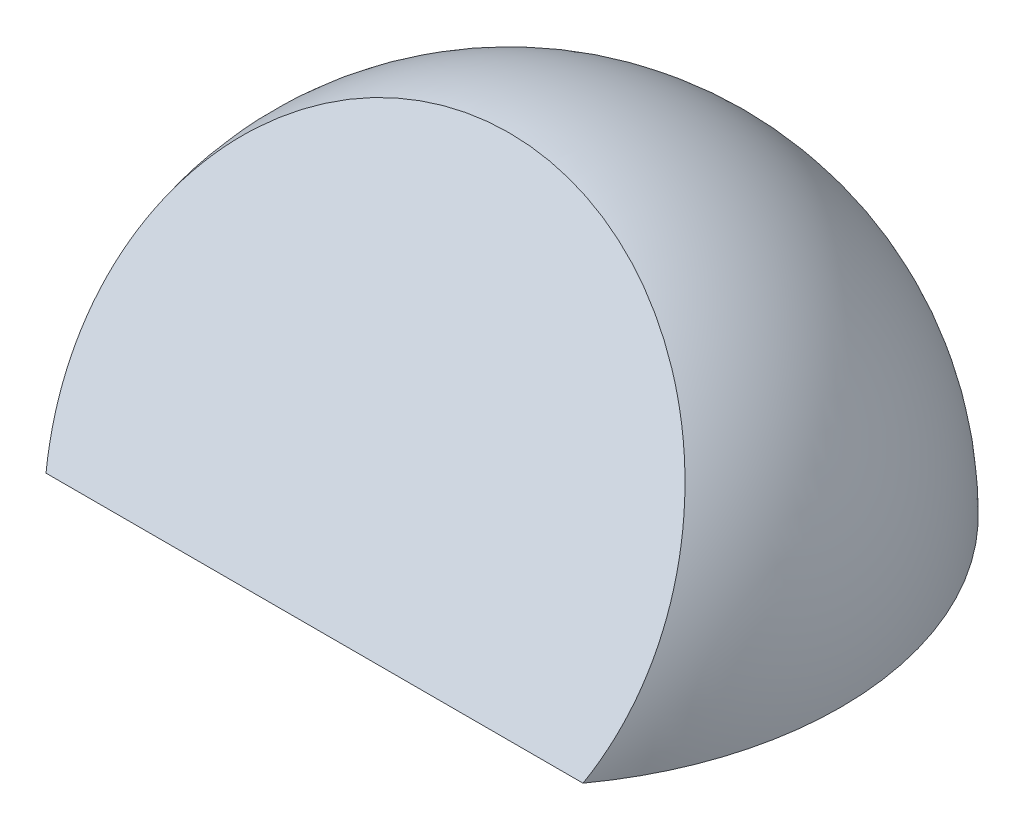
ISO-10303-21;
HEADER;
FILE_DESCRIPTION(('STEP AP214'),'2;1');
FILE_NAME('part.step','',(''),(''),'','','');
FILE_SCHEMA(('AUTOMOTIVE_DESIGN { 1 0 10303 214 1 1 1 1 }'));
ENDSEC;
DATA;
#1=APPLICATION_CONTEXT('core data for automotive mechanical design processes');
#2=APPLICATION_PROTOCOL_DEFINITION('international standard','automotive_design',2000,#1);
#3=PRODUCT_CONTEXT('',#1,'mechanical');
#4=PRODUCT('Part','Part','',(#3));
#5=PRODUCT_RELATED_PRODUCT_CATEGORY('part','',(#4));
#6=PRODUCT_DEFINITION_FORMATION('','',#4);
#7=PRODUCT_DEFINITION_CONTEXT('part definition',#1,'design');
#8=PRODUCT_DEFINITION('design','',#6,#7);
#9=PRODUCT_DEFINITION_SHAPE('','',#8);
#10=(LENGTH_UNIT() NAMED_UNIT(*) SI_UNIT(.MILLI.,.METRE.));
#11=(NAMED_UNIT(*) PLANE_ANGLE_UNIT() SI_UNIT($,.RADIAN.));
#12=(NAMED_UNIT(*) SI_UNIT($,.STERADIAN.) SOLID_ANGLE_UNIT());
#13=UNCERTAINTY_MEASURE_WITH_UNIT(LENGTH_MEASURE(1.E-05),#10,'distance_accuracy_value','');
#14=(GEOMETRIC_REPRESENTATION_CONTEXT(3) GLOBAL_UNCERTAINTY_ASSIGNED_CONTEXT((#13)) GLOBAL_UNIT_ASSIGNED_CONTEXT((#10,
#11,#12)) REPRESENTATION_CONTEXT('',''));
#15=CARTESIAN_POINT('',(0.,0.,0.));
#16=DIRECTION('',(0.,0.,1.));
#17=DIRECTION('',(1.,0.,0.));
#18=AXIS2_PLACEMENT_3D('',#15,#16,#17);
#19=CARTESIAN_POINT('',(-3.34897331317427,24.8888594866687,88.2251038844284));
#20=DIRECTION('',(0.,0.506284285163045,0.862366640470829));
#21=DIRECTION('',(0.,-0.862366640470829,0.506284285163045));
#22=AXIS2_PLACEMENT_3D('',#19,#20,#21);
#23=PLANE('',#22);
#24=DIRECTION('',(1.,0.,0.));
#25=VECTOR('',#24,1.);
#26=CARTESIAN_POINT('',(-3.34897331317427,6.41500741416223E-12,102.837030926097));
#27=LINE('',#26,#25);
#28=CARTESIAN_POINT('',(-86.7237021897946,6.41500741416223E-12,102.837030926097));
#29=VERTEX_POINT('',#28);
#30=CARTESIAN_POINT('',(80.0257555634461,6.41500741416223E-12,102.837030926097));
#31=VERTEX_POINT('',#30);
#32=EDGE_CURVE('E61',#29,#31,#27,.T.);
#33=ORIENTED_EDGE('',*,*,#32,.F.);
#34=CARTESIAN_POINT('',(-3.34897331317427,24.8888594866687,88.2251038844284));
#35=DIRECTION('',(0.,0.506284285163045,0.862366640470829));
#36=DIRECTION('',(0.,-0.862366640470829,0.506284285163045));
#37=AXIS2_PLACEMENT_3D('',#34,#35,#36);
#38=CIRCLE('',#37,88.2287320189306);
#39=EDGE_CURVE('E11',#31,#29,#38,.T.);
#40=ORIENTED_EDGE('',*,*,#39,.F.);
#41=EDGE_LOOP('',(#33,#40));
#42=FACE_BOUND('',#41,.T.);
#43=ADVANCED_FACE('F41',(#42),#23,.F.);
#44=CARTESIAN_POINT('',(-3.34897331317427,0.,45.8312892437925));
#45=DIRECTION('',(-1.,0.,0.));
#46=DIRECTION('',(0.,0.,1.));
#47=AXIS2_PLACEMENT_3D('',#44,#45,#46);
#48=SPHERICAL_SURFACE('',#47,101.);
#49=CARTESIAN_POINT('',(-3.34897331317427,0.,45.8312892437925));
#50=DIRECTION('',(0.,-1.,0.));
#51=DIRECTION('',(0.,0.,-1.));
#52=AXIS2_PLACEMENT_3D('',#49,#50,#51);
#53=CIRCLE('',#52,101.);
#54=EDGE_CURVE('E75',#29,#31,#53,.T.);
#55=ORIENTED_EDGE('',*,*,#54,.T.);
#56=ORIENTED_EDGE('',*,*,#39,.T.);
#57=EDGE_LOOP('',(#55,#56));
#58=FACE_BOUND('',#57,.T.);
#59=ADVANCED_FACE('F82',(#58),#48,.F.);
#60=CARTESIAN_POINT('',(-3.34897331317427,0.,45.8312892437925));
#61=DIRECTION('',(-1.,0.,0.));
#62=DIRECTION('',(0.,0.,1.));
#63=AXIS2_PLACEMENT_3D('',#60,#61,#62);
#64=SPHERICAL_SURFACE('',#63,105.);
#65=CARTESIAN_POINT('',(-3.34897331317427,26.9139966273209,91.6745704463117));
#66=DIRECTION('',(0.,0.506284285163045,0.862366640470829));
#67=DIRECTION('',(0.,-0.862366640470829,0.506284285163045));
#68=AXIS2_PLACEMENT_3D('',#65,#66,#67);
#69=CIRCLE('',#68,90.548497249437);
#70=CARTESIAN_POINT('',(81.6510266868231,6.57807142090405E-12,107.475429273482));
#71=VERTEX_POINT('',#70);
#72=CARTESIAN_POINT('',(-88.3489733131716,6.57807142090405E-12,107.475429273482));
#73=VERTEX_POINT('',#72);
#74=EDGE_CURVE('E71',#71,#73,#69,.T.);
#75=ORIENTED_EDGE('',*,*,#74,.F.);
#76=CARTESIAN_POINT('',(-3.34897331317427,0.,45.8312892437925));
#77=DIRECTION('',(0.,-1.,0.));
#78=DIRECTION('',(0.,0.,-1.));
#79=AXIS2_PLACEMENT_3D('',#76,#77,#78);
#80=CIRCLE('',#79,105.);
#81=EDGE_CURVE('E49',#73,#71,#80,.T.);
#82=ORIENTED_EDGE('',*,*,#81,.F.);
#83=EDGE_LOOP('',(#75,#82));
#84=FACE_BOUND('',#83,.T.);
#85=ADVANCED_FACE('F43',(#84),#64,.T.);
#86=CARTESIAN_POINT('',(-3.34897331317427,0.,45.8312892437925));
#87=DIRECTION('',(0.,-1.,0.));
#88=DIRECTION('',(0.,0.,-1.));
#89=AXIS2_PLACEMENT_3D('',#86,#87,#88);
#90=PLANE('',#89);
#91=ORIENTED_EDGE('',*,*,#32,.T.);
#92=ORIENTED_EDGE('',*,*,#54,.F.);
#93=EDGE_LOOP('',(#91,#92));
#94=FACE_BOUND('',#93,.T.);
#95=ORIENTED_EDGE('',*,*,#81,.T.);
#96=DIRECTION('',(-1.,0.,0.));
#97=VECTOR('',#96,1.);
#98=CARTESIAN_POINT('',(275.188697082898,6.57807142090405E-12,107.475429273482));
#99=LINE('',#98,#97);
#100=EDGE_CURVE('E66',#71,#73,#99,.T.);
#101=ORIENTED_EDGE('',*,*,#100,.T.);
#102=EDGE_LOOP('',(#95,#101));
#103=FACE_BOUND('',#102,.T.);
#104=ADVANCED_FACE('F68',(#94,#103),#90,.T.);
#105=CARTESIAN_POINT('',(275.188697082898,6.57807142090405E-12,107.475429273482));
#106=DIRECTION('',(0.,0.506284285163045,0.862366640470829));
#107=DIRECTION('',(0.,-0.862366640470829,0.506284285163045));
#108=AXIS2_PLACEMENT_3D('',#105,#106,#107);
#109=PLANE('',#108);
#110=ORIENTED_EDGE('',*,*,#74,.T.);
#111=ORIENTED_EDGE('',*,*,#100,.F.);
#112=EDGE_LOOP('',(#110,#111));
#113=FACE_BOUND('',#112,.T.);
#114=ADVANCED_FACE('F73',(#113),#109,.T.);
#115=CLOSED_SHELL('',(#43,#59,#85,#104,#114));
#116=MANIFOLD_SOLID_BREP('B2',#115);
#117=ADVANCED_BREP_SHAPE_REPRESENTATION('',(#18,#116),#14);
#118=SHAPE_DEFINITION_REPRESENTATION(#9,#117);
ENDSEC;
END-ISO-10303-21;
